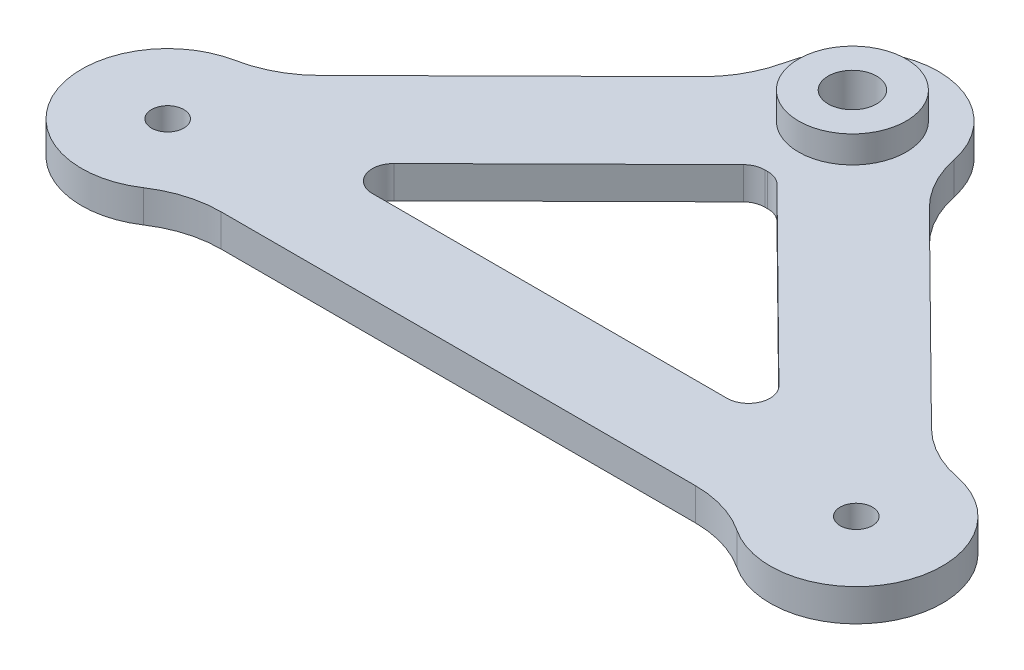
ISO-10303-21;
HEADER;
FILE_DESCRIPTION(('STEP AP214'),'2;1');
FILE_NAME('part.step','',(''),(''),'','','');
FILE_SCHEMA(('AUTOMOTIVE_DESIGN { 1 0 10303 214 1 1 1 1 }'));
ENDSEC;
DATA;
#1=APPLICATION_CONTEXT('core data for automotive mechanical design processes');
#2=APPLICATION_PROTOCOL_DEFINITION('international standard','automotive_design',2000,#1);
#3=PRODUCT_CONTEXT('',#1,'mechanical');
#4=PRODUCT('Part','Part','',(#3));
#5=PRODUCT_RELATED_PRODUCT_CATEGORY('part','',(#4));
#6=PRODUCT_DEFINITION_FORMATION('','',#4);
#7=PRODUCT_DEFINITION_CONTEXT('part definition',#1,'design');
#8=PRODUCT_DEFINITION('design','',#6,#7);
#9=PRODUCT_DEFINITION_SHAPE('','',#8);
#10=(LENGTH_UNIT() NAMED_UNIT(*) SI_UNIT(.MILLI.,.METRE.));
#11=(NAMED_UNIT(*) PLANE_ANGLE_UNIT() SI_UNIT($,.RADIAN.));
#12=(NAMED_UNIT(*) SI_UNIT($,.STERADIAN.) SOLID_ANGLE_UNIT());
#13=UNCERTAINTY_MEASURE_WITH_UNIT(LENGTH_MEASURE(1.E-05),#10,'distance_accuracy_value','');
#14=(GEOMETRIC_REPRESENTATION_CONTEXT(3) GLOBAL_UNCERTAINTY_ASSIGNED_CONTEXT((#13)) GLOBAL_UNIT_ASSIGNED_CONTEXT((#10,
#11,#12)) REPRESENTATION_CONTEXT('',''));
#15=CARTESIAN_POINT('',(0.,0.,0.));
#16=DIRECTION('',(0.,0.,1.));
#17=DIRECTION('',(1.,0.,0.));
#18=AXIS2_PLACEMENT_3D('',#15,#16,#17);
#19=CARTESIAN_POINT('',(0.,5.5,-29.5470634829801));
#20=DIRECTION('',(0.,1.,0.));
#21=DIRECTION('',(0.,0.,1.));
#22=AXIS2_PLACEMENT_3D('',#19,#20,#21);
#23=PLANE('',#22);
#24=CARTESIAN_POINT('',(0.,5.5,-29.5470634829801));
#25=DIRECTION('',(0.,1.,0.));
#26=DIRECTION('',(0.,0.,1.));
#27=AXIS2_PLACEMENT_3D('',#24,#25,#26);
#28=CIRCLE('',#27,5.);
#29=CARTESIAN_POINT('',(0.,5.5,-24.5470634829801));
#30=VERTEX_POINT('',#29);
#31=EDGE_CURVE('E11',#30,#30,#28,.T.);
#32=ORIENTED_EDGE('',*,*,#31,.T.);
#33=EDGE_LOOP('',(#32));
#34=FACE_BOUND('',#33,.T.);
#35=CARTESIAN_POINT('',(0.,5.5,-29.5470634829801));
#36=DIRECTION('',(0.,1.,0.));
#37=DIRECTION('',(0.,0.,1.));
#38=AXIS2_PLACEMENT_3D('',#35,#36,#37);
#39=CIRCLE('',#38,2.25);
#40=CARTESIAN_POINT('',(0.,5.5,-27.2970634829802));
#41=VERTEX_POINT('',#40);
#42=EDGE_CURVE('E52',#41,#41,#39,.T.);
#43=ORIENTED_EDGE('',*,*,#42,.F.);
#44=EDGE_LOOP('',(#43));
#45=FACE_BOUND('',#44,.T.);
#46=ADVANCED_FACE('F45',(#34,#45),#23,.T.);
#47=CARTESIAN_POINT('',(0.,5.5,-29.5470634829801));
#48=DIRECTION('',(0.,-1.,0.));
#49=DIRECTION('',(0.,0.,-1.));
#50=AXIS2_PLACEMENT_3D('',#47,#48,#49);
#51=CYLINDRICAL_SURFACE('',#50,5.);
#52=ORIENTED_EDGE('',*,*,#31,.F.);
#53=EDGE_LOOP('',(#52));
#54=FACE_BOUND('',#53,.T.);
#55=CARTESIAN_POINT('',(0.,0.,-29.5470634829801));
#56=DIRECTION('',(0.,1.,0.));
#57=DIRECTION('',(0.,0.,1.));
#58=AXIS2_PLACEMENT_3D('',#55,#56,#57);
#59=CIRCLE('',#58,5.);
#60=CARTESIAN_POINT('',(0.,0.,-24.5470634829801));
#61=VERTEX_POINT('',#60);
#62=EDGE_CURVE('E56',#61,#61,#59,.T.);
#63=ORIENTED_EDGE('',*,*,#62,.T.);
#64=EDGE_LOOP('',(#63));
#65=FACE_BOUND('',#64,.T.);
#66=ADVANCED_FACE('F47',(#54,#65),#51,.T.);
#67=CARTESIAN_POINT('',(0.,5.5,-29.5470634829801));
#68=DIRECTION('',(0.,-1.,0.));
#69=DIRECTION('',(0.,0.,-1.));
#70=AXIS2_PLACEMENT_3D('',#67,#68,#69);
#71=CYLINDRICAL_SURFACE('',#70,2.25);
#72=ORIENTED_EDGE('',*,*,#42,.T.);
#73=EDGE_LOOP('',(#72));
#74=FACE_BOUND('',#73,.T.);
#75=CARTESIAN_POINT('',(0.,0.,-29.5470634829801));
#76=DIRECTION('',(0.,1.,0.));
#77=DIRECTION('',(0.,0.,1.));
#78=AXIS2_PLACEMENT_3D('',#75,#76,#77);
#79=CIRCLE('',#78,2.25);
#80=CARTESIAN_POINT('',(0.,0.,-27.2970634829802));
#81=VERTEX_POINT('',#80);
#82=EDGE_CURVE('E60',#81,#81,#79,.T.);
#83=ORIENTED_EDGE('',*,*,#82,.F.);
#84=EDGE_LOOP('',(#83));
#85=FACE_BOUND('',#84,.T.);
#86=ADVANCED_FACE('F69',(#74,#85),#71,.F.);
#87=CARTESIAN_POINT('',(0.,0.,-29.5470634829801));
#88=DIRECTION('',(0.,1.,0.));
#89=DIRECTION('',(0.,0.,1.));
#90=AXIS2_PLACEMENT_3D('',#87,#88,#89);
#91=PLANE('',#90);
#92=ORIENTED_EDGE('',*,*,#82,.T.);
#93=EDGE_LOOP('',(#92));
#94=FACE_BOUND('',#93,.T.);
#95=ORIENTED_EDGE('',*,*,#62,.F.);
#96=EDGE_LOOP('',(#95));
#97=FACE_BOUND('',#96,.T.);
#98=ADVANCED_FACE('F66',(#94,#97),#91,.F.);
#99=CLOSED_SHELL('',(#46,#66,#86,#98));
#100=MANIFOLD_SOLID_BREP('B2',#99);
#101=CARTESIAN_POINT('',(0.,3.,0.));
#102=DIRECTION('',(1.,0.,0.));
#103=DIRECTION('',(0.,0.,-1.));
#104=AXIS2_PLACEMENT_3D('',#101,#102,#103);
#105=PLANE('',#104);
#106=DIRECTION('',(0.,0.,1.));
#107=VECTOR('',#106,1.);
#108=CARTESIAN_POINT('',(0.,0.,0.));
#109=LINE('',#108,#107);
#110=CARTESIAN_POINT('',(0.,0.,-22.5169864866705));
#111=VERTEX_POINT('',#110);
#112=CARTESIAN_POINT('',(0.,0.,-22.5158134829802));
#113=VERTEX_POINT('',#112);
#114=EDGE_CURVE('E268',#111,#113,#109,.T.);
#115=ORIENTED_EDGE('',*,*,#114,.F.);
#116=DIRECTION('',(0.,-1.,0.));
#117=VECTOR('',#116,1.);
#118=CARTESIAN_POINT('',(0.,3.,-22.5169864866705));
#119=LINE('',#118,#117);
#120=CARTESIAN_POINT('',(0.,3.,-22.5169864866705));
#121=VERTEX_POINT('',#120);
#122=EDGE_CURVE('E262',#121,#111,#119,.T.);
#123=ORIENTED_EDGE('',*,*,#122,.F.);
#124=DIRECTION('',(0.,0.,1.));
#125=VECTOR('',#124,1.);
#126=CARTESIAN_POINT('',(0.,3.,0.));
#127=LINE('',#126,#125);
#128=CARTESIAN_POINT('',(0.,3.,-22.5158134829802));
#129=VERTEX_POINT('',#128);
#130=EDGE_CURVE('E265',#121,#129,#127,.T.);
#131=ORIENTED_EDGE('',*,*,#130,.T.);
#132=DIRECTION('',(0.,-1.,0.));
#133=VECTOR('',#132,1.);
#134=CARTESIAN_POINT('',(0.,3.,-22.5158134829802));
#135=LINE('',#134,#133);
#136=EDGE_CURVE('E300',#129,#113,#135,.T.);
#137=ORIENTED_EDGE('',*,*,#136,.T.);
#138=EDGE_LOOP('',(#115,#123,#131,#137));
#139=FACE_BOUND('',#138,.T.);
#140=ADVANCED_FACE('F107',(#139),#105,.T.);
#141=CARTESIAN_POINT('',(11.2577723363418,3.,-11.3858986330326));
#142=DIRECTION('',(0.703094453053331,0.,-0.711096470308802));
#143=DIRECTION('',(-0.711096470308802,0.,-0.703094453053331));
#144=AXIS2_PLACEMENT_3D('',#141,#142,#143);
#145=PLANE('',#144);
#146=DIRECTION('',(0.711096470308802,0.,0.703094453053331));
#147=VECTOR('',#146,1.);
#148=CARTESIAN_POINT('',(11.2577723363418,0.,-11.3858986330326));
#149=LINE('',#148,#147);
#150=CARTESIAN_POINT('',(0.000593189258373851,0.,-22.5163999726115));
#151=VERTEX_POINT('',#150);
#152=EDGE_CURVE('E331',#111,#151,#149,.T.);
#153=ORIENTED_EDGE('',*,*,#152,.T.);
#154=DIRECTION('',(0.,-1.,0.));
#155=VECTOR('',#154,1.);
#156=CARTESIAN_POINT('',(0.000593189258373851,3.,-22.5163999726115));
#157=LINE('',#156,#155);
#158=CARTESIAN_POINT('',(0.000593189258373851,3.,-22.5163999726115));
#159=VERTEX_POINT('',#158);
#160=EDGE_CURVE('E273',#159,#151,#157,.T.);
#161=ORIENTED_EDGE('',*,*,#160,.F.);
#162=DIRECTION('',(0.711096470308802,0.,0.703094453053331));
#163=VECTOR('',#162,1.);
#164=CARTESIAN_POINT('',(11.2577723363418,3.,-11.3858986330326));
#165=LINE('',#164,#163);
#166=EDGE_CURVE('E276',#121,#159,#165,.T.);
#167=ORIENTED_EDGE('',*,*,#166,.F.);
#168=ORIENTED_EDGE('',*,*,#122,.T.);
#169=EDGE_LOOP('',(#153,#161,#167,#168));
#170=FACE_BOUND('',#169,.T.);
#171=ADVANCED_FACE('F277',(#170),#145,.F.);
#172=CARTESIAN_POINT('',(11.2577723363418,3.,-11.3858986330326));
#173=DIRECTION('',(0.703094453053331,0.,-0.711096470308802));
#174=DIRECTION('',(-0.711096470308802,0.,-0.703094453053331));
#175=AXIS2_PLACEMENT_3D('',#172,#173,#174);
#176=PLANE('',#175);
#177=DIRECTION('',(0.711096470308802,0.,0.703094453053331));
#178=VECTOR('',#177,1.);
#179=CARTESIAN_POINT('',(11.2577723363418,0.,-11.3858986330326));
#180=LINE('',#179,#178);
#181=CARTESIAN_POINT('',(1.56408418580728,0.,-20.9705030472689));
#182=VERTEX_POINT('',#181);
#183=CARTESIAN_POINT('',(17.8876045404997,0.,-4.83067238448501));
#184=VERTEX_POINT('',#183);
#185=EDGE_CURVE('E319',#182,#184,#180,.T.);
#186=ORIENTED_EDGE('',*,*,#185,.T.);
#187=DIRECTION('',(0.,-1.,0.));
#188=VECTOR('',#187,1.);
#189=CARTESIAN_POINT('',(17.8876045404997,3.,-4.83067238448501));
#190=LINE('',#189,#188);
#191=CARTESIAN_POINT('',(17.8876045404997,3.,-4.83067238448501));
#192=VERTEX_POINT('',#191);
#193=EDGE_CURVE('E409',#184,#192,#190,.F.);
#194=ORIENTED_EDGE('',*,*,#193,.T.);
#195=DIRECTION('',(0.711096470308802,0.,0.703094453053331));
#196=VECTOR('',#195,1.);
#197=CARTESIAN_POINT('',(11.2577723363418,3.,-11.3858986330326));
#198=LINE('',#197,#196);
#199=CARTESIAN_POINT('',(1.56408418580728,3.,-20.9705030472689));
#200=VERTEX_POINT('',#199);
#201=EDGE_CURVE('E454',#200,#192,#198,.T.);
#202=ORIENTED_EDGE('',*,*,#201,.F.);
#203=DIRECTION('',(0.,1.,0.));
#204=VECTOR('',#203,1.);
#205=CARTESIAN_POINT('',(1.56408418580728,0.,-20.9705030472689));
#206=LINE('',#205,#204);
#207=EDGE_CURVE('E406',#200,#182,#206,.F.);
#208=ORIENTED_EDGE('',*,*,#207,.T.);
#209=EDGE_LOOP('',(#186,#194,#202,#208));
#210=FACE_BOUND('',#209,.T.);
#211=ADVANCED_FACE('F452',(#210),#176,.F.);
#212=CARTESIAN_POINT('',(0.,3.,-1.4084794438674));
#213=DIRECTION('',(0.,0.,-1.));
#214=DIRECTION('',(-1.,0.,0.));
#215=AXIS2_PLACEMENT_3D('',#212,#213,#214);
#216=PLANE('',#215);
#217=DIRECTION('',(1.,0.,0.));
#218=VECTOR('',#217,1.);
#219=CARTESIAN_POINT('',(0.,3.,-1.4084794438674));
#220=LINE('',#219,#218);
#221=CARTESIAN_POINT('',(-16.4809742625331,3.,-1.4084794438674));
#222=VERTEX_POINT('',#221);
#223=CARTESIAN_POINT('',(16.481415634393,3.,-1.4084794438674));
#224=VERTEX_POINT('',#223);
#225=EDGE_CURVE('E465',#222,#224,#220,.T.);
#226=ORIENTED_EDGE('',*,*,#225,.T.);
#227=DIRECTION('',(0.,-1.,0.));
#228=VECTOR('',#227,1.);
#229=CARTESIAN_POINT('',(16.481415634393,3.,-1.4084794438674));
#230=LINE('',#229,#228);
#231=CARTESIAN_POINT('',(16.481415634393,0.,-1.4084794438674));
#232=VERTEX_POINT('',#231);
#233=EDGE_CURVE('E403',#224,#232,#230,.T.);
#234=ORIENTED_EDGE('',*,*,#233,.T.);
#235=DIRECTION('',(1.,0.,0.));
#236=VECTOR('',#235,1.);
#237=CARTESIAN_POINT('',(0.,0.,-1.4084794438674));
#238=LINE('',#237,#236);
#239=CARTESIAN_POINT('',(-16.4809742625331,0.,-1.4084794438674));
#240=VERTEX_POINT('',#239);
#241=EDGE_CURVE('E322',#240,#232,#238,.T.);
#242=ORIENTED_EDGE('',*,*,#241,.F.);
#243=DIRECTION('',(0.,-1.,0.));
#244=VECTOR('',#243,1.);
#245=CARTESIAN_POINT('',(-16.4809742625331,3.,-1.4084794438674));
#246=LINE('',#245,#244);
#247=EDGE_CURVE('E401',#240,#222,#246,.F.);
#248=ORIENTED_EDGE('',*,*,#247,.T.);
#249=EDGE_LOOP('',(#226,#234,#242,#248));
#250=FACE_BOUND('',#249,.T.);
#251=ADVANCED_FACE('F462',(#250),#216,.T.);
#252=CARTESIAN_POINT('',(-11.257180556488,3.,-11.3857743242329));
#253=DIRECTION('',(-0.703079645313617,0.,-0.711111111111111));
#254=DIRECTION('',(-0.711111111111111,0.,0.703079645313617));
#255=AXIS2_PLACEMENT_3D('',#252,#253,#254);
#256=PLANE('',#255);
#257=DIRECTION('',(0.711111111111111,0.,-0.703079645313617));
#258=VECTOR('',#257,1.);
#259=CARTESIAN_POINT('',(-11.257180556488,3.,-11.3857743242329));
#260=LINE('',#259,#258);
#261=CARTESIAN_POINT('',(-17.8871335531603,3.,-4.83070166608962));
#262=VERTEX_POINT('',#261);
#263=CARTESIAN_POINT('',(-1.56295087817351,3.,-20.9705149608521));
#264=VERTEX_POINT('',#263);
#265=EDGE_CURVE('E286',#262,#264,#260,.T.);
#266=ORIENTED_EDGE('',*,*,#265,.F.);
#267=DIRECTION('',(0.,-1.,0.));
#268=VECTOR('',#267,1.);
#269=CARTESIAN_POINT('',(-17.8871335531603,3.,-4.83070166608962));
#270=LINE('',#269,#268);
#271=CARTESIAN_POINT('',(-17.8871335531603,0.,-4.83070166608962));
#272=VERTEX_POINT('',#271);
#273=EDGE_CURVE('E413',#262,#272,#270,.T.);
#274=ORIENTED_EDGE('',*,*,#273,.T.);
#275=DIRECTION('',(0.711111111111111,0.,-0.703079645313617));
#276=VECTOR('',#275,1.);
#277=CARTESIAN_POINT('',(-11.257180556488,0.,-11.3857743242329));
#278=LINE('',#277,#276);
#279=CARTESIAN_POINT('',(-1.56295087817351,0.,-20.9705149608521));
#280=VERTEX_POINT('',#279);
#281=EDGE_CURVE('E325',#272,#280,#278,.T.);
#282=ORIENTED_EDGE('',*,*,#281,.T.);
#283=DIRECTION('',(0.,1.,0.));
#284=VECTOR('',#283,1.);
#285=CARTESIAN_POINT('',(-1.56295087817351,3.,-20.9705149608521));
#286=LINE('',#285,#284);
#287=EDGE_CURVE('E411',#280,#264,#286,.T.);
#288=ORIENTED_EDGE('',*,*,#287,.T.);
#289=EDGE_LOOP('',(#266,#274,#282,#288));
#290=FACE_BOUND('',#289,.T.);
#291=ADVANCED_FACE('F442',(#290),#256,.F.);
#292=CARTESIAN_POINT('',(0.,3.,7.09152055613258));
#293=DIRECTION('',(0.,0.,-1.));
#294=DIRECTION('',(-1.,0.,0.));
#295=AXIS2_PLACEMENT_3D('',#292,#293,#294);
#296=PLANE('',#295);
#297=DIRECTION('',(1.,0.,0.));
#298=VECTOR('',#297,1.);
#299=CARTESIAN_POINT('',(0.,0.,7.09152055613258));
#300=LINE('',#299,#298);
#301=CARTESIAN_POINT('',(-22.0501256289338,0.,7.09152055613258));
#302=VERTEX_POINT('',#301);
#303=CARTESIAN_POINT('',(22.0501256289338,0.,7.09152055613259));
#304=VERTEX_POINT('',#303);
#305=EDGE_CURVE('E301',#302,#304,#300,.T.);
#306=ORIENTED_EDGE('',*,*,#305,.T.);
#307=DIRECTION('',(0.,1.,0.));
#308=VECTOR('',#307,1.);
#309=CARTESIAN_POINT('',(22.0501256289338,3.,7.09152055613259));
#310=LINE('',#309,#308);
#311=CARTESIAN_POINT('',(22.0501256289338,3.,7.09152055613259));
#312=VERTEX_POINT('',#311);
#313=EDGE_CURVE('E365',#304,#312,#310,.T.);
#314=ORIENTED_EDGE('',*,*,#313,.T.);
#315=DIRECTION('',(1.,0.,0.));
#316=VECTOR('',#315,1.);
#317=CARTESIAN_POINT('',(0.,3.,7.09152055613258));
#318=LINE('',#317,#316);
#319=CARTESIAN_POINT('',(-22.0501256289338,3.,7.09152055613258));
#320=VERTEX_POINT('',#319);
#321=EDGE_CURVE('E345',#320,#312,#318,.T.);
#322=ORIENTED_EDGE('',*,*,#321,.F.);
#323=DIRECTION('',(0.,1.,0.));
#324=VECTOR('',#323,1.);
#325=CARTESIAN_POINT('',(-22.0501256289338,0.,7.09152055613258));
#326=LINE('',#325,#324);
#327=EDGE_CURVE('E362',#320,#302,#326,.F.);
#328=ORIENTED_EDGE('',*,*,#327,.T.);
#329=EDGE_LOOP('',(#306,#314,#322,#328));
#330=FACE_BOUND('',#329,.T.);
#331=ADVANCED_FACE('F541',(#330),#296,.F.);
#332=CARTESIAN_POINT('',(32.,3.,2.09152055613259));
#333=DIRECTION('',(0.,-1.,0.));
#334=DIRECTION('',(0.,0.,-1.));
#335=AXIS2_PLACEMENT_3D('',#332,#333,#334);
#336=CYLINDRICAL_SURFACE('',#335,8.);
#337=CARTESIAN_POINT('',(32.,0.,2.09152055613259));
#338=DIRECTION('',(0.,1.,0.));
#339=DIRECTION('',(0.,0.,1.));
#340=AXIS2_PLACEMENT_3D('',#337,#338,#339);
#341=CIRCLE('',#340,8.);
#342=CARTESIAN_POINT('',(27.5778336128595,0.,8.75818722279926));
#343=VERTEX_POINT('',#342);
#344=CARTESIAN_POINT('',(33.5419702056243,0.,-5.7584684811188));
#345=VERTEX_POINT('',#344);
#346=EDGE_CURVE('E304',#343,#345,#341,.T.);
#347=ORIENTED_EDGE('',*,*,#346,.T.);
#348=DIRECTION('',(0.,-1.,0.));
#349=VECTOR('',#348,1.);
#350=CARTESIAN_POINT('',(33.5419702056243,3.,-5.7584684811188));
#351=LINE('',#350,#349);
#352=CARTESIAN_POINT('',(33.5419702056243,3.,-5.7584684811188));
#353=VERTEX_POINT('',#352);
#354=EDGE_CURVE('E360',#345,#353,#351,.F.);
#355=ORIENTED_EDGE('',*,*,#354,.T.);
#356=CARTESIAN_POINT('',(32.,3.,2.09152055613259));
#357=DIRECTION('',(0.,1.,0.));
#358=DIRECTION('',(0.,0.,1.));
#359=AXIS2_PLACEMENT_3D('',#356,#357,#358);
#360=CIRCLE('',#359,8.);
#361=CARTESIAN_POINT('',(27.5778336128595,3.,8.75818722279926));
#362=VERTEX_POINT('',#361);
#363=EDGE_CURVE('E482',#362,#353,#360,.T.);
#364=ORIENTED_EDGE('',*,*,#363,.F.);
#365=DIRECTION('',(0.,-1.,0.));
#366=VECTOR('',#365,1.);
#367=CARTESIAN_POINT('',(27.5778336128595,3.,8.75818722279926));
#368=LINE('',#367,#366);
#369=EDGE_CURVE('E357',#362,#343,#368,.T.);
#370=ORIENTED_EDGE('',*,*,#369,.T.);
#371=EDGE_LOOP('',(#347,#355,#364,#370));
#372=FACE_BOUND('',#371,.T.);
#373=ADVANCED_FACE('F499',(#372),#336,.T.);
#374=CARTESIAN_POINT('',(18.2880580238333,3.,-18.4961969946937));
#375=DIRECTION('',(-0.70309445305332,0.,0.711096470308813));
#376=DIRECTION('',(0.711096470308813,0.,0.70309445305332));
#377=AXIS2_PLACEMENT_3D('',#374,#375,#376);
#378=PLANE('',#377);
#379=DIRECTION('',(-0.711096470308813,0.,-0.70309445305332));
#380=VECTOR('',#379,1.);
#381=CARTESIAN_POINT('',(18.2880580238333,0.,-18.4961969946937));
#382=LINE('',#381,#380);
#383=CARTESIAN_POINT('',(28.4384884321214,0.,-8.45999007459491));
#384=VERTEX_POINT('',#383);
#385=CARTESIAN_POINT('',(10.5907928105479,0.,-26.1068443556502));
#386=VERTEX_POINT('',#385);
#387=EDGE_CURVE('E307',#384,#386,#382,.T.);
#388=ORIENTED_EDGE('',*,*,#387,.T.);
#389=DIRECTION('',(0.,1.,0.));
#390=VECTOR('',#389,1.);
#391=CARTESIAN_POINT('',(10.5907928105479,3.,-26.1068443556502));
#392=LINE('',#391,#390);
#393=CARTESIAN_POINT('',(10.5907928105479,3.,-26.1068443556502));
#394=VERTEX_POINT('',#393);
#395=EDGE_CURVE('E355',#386,#394,#392,.T.);
#396=ORIENTED_EDGE('',*,*,#395,.T.);
#397=DIRECTION('',(-0.711096470308813,0.,-0.70309445305332));
#398=VECTOR('',#397,1.);
#399=CARTESIAN_POINT('',(18.2880580238333,3.,-18.4961969946937));
#400=LINE('',#399,#398);
#401=CARTESIAN_POINT('',(28.4384884321214,3.,-8.45999007459491));
#402=VERTEX_POINT('',#401);
#403=EDGE_CURVE('E479',#402,#394,#400,.T.);
#404=ORIENTED_EDGE('',*,*,#403,.F.);
#405=DIRECTION('',(0.,1.,0.));
#406=VECTOR('',#405,1.);
#407=CARTESIAN_POINT('',(28.4384884321214,0.,-8.45999007459491));
#408=LINE('',#407,#406);
#409=EDGE_CURVE('E352',#402,#384,#408,.F.);
#410=ORIENTED_EDGE('',*,*,#409,.T.);
#411=EDGE_LOOP('',(#388,#396,#404,#410));
#412=FACE_BOUND('',#411,.T.);
#413=ADVANCED_FACE('F510',(#412),#378,.F.);
#414=CARTESIAN_POINT('',(0.,3.,-29.5470634829801));
#415=DIRECTION('',(0.,-1.,0.));
#416=DIRECTION('',(0.,0.,-1.));
#417=AXIS2_PLACEMENT_3D('',#414,#415,#416);
#418=CYLINDRICAL_SURFACE('',#417,8.);
#419=CARTESIAN_POINT('',(0.,3.,-29.5470634829801));
#420=DIRECTION('',(0.,1.,0.));
#421=DIRECTION('',(0.,0.,1.));
#422=AXIS2_PLACEMENT_3D('',#419,#420,#421);
#423=CIRCLE('',#422,8.);
#424=CARTESIAN_POINT('',(7.83188326270271,3.,-31.1785059610949));
#425=VERTEX_POINT('',#424);
#426=CARTESIAN_POINT('',(-7.83184928850183,3.,-31.1786690487323));
#427=VERTEX_POINT('',#426);
#428=EDGE_CURVE('E476',#425,#427,#423,.T.);
#429=ORIENTED_EDGE('',*,*,#428,.F.);
#430=DIRECTION('',(0.,-1.,0.));
#431=VECTOR('',#430,1.);
#432=CARTESIAN_POINT('',(7.83188326270271,3.,-31.1785059610949));
#433=LINE('',#432,#431);
#434=CARTESIAN_POINT('',(7.83188326270271,0.,-31.1785059610949));
#435=VERTEX_POINT('',#434);
#436=EDGE_CURVE('E349',#425,#435,#433,.T.);
#437=ORIENTED_EDGE('',*,*,#436,.T.);
#438=CARTESIAN_POINT('',(0.,0.,-29.5470634829801));
#439=DIRECTION('',(0.,1.,0.));
#440=DIRECTION('',(0.,0.,1.));
#441=AXIS2_PLACEMENT_3D('',#438,#439,#440);
#442=CIRCLE('',#441,8.);
#443=CARTESIAN_POINT('',(-7.83184928850183,0.,-31.1786690487323));
#444=VERTEX_POINT('',#443);
#445=EDGE_CURVE('E310',#435,#444,#442,.T.);
#446=ORIENTED_EDGE('',*,*,#445,.T.);
#447=DIRECTION('',(0.,-1.,0.));
#448=VECTOR('',#447,1.);
#449=CARTESIAN_POINT('',(-7.83184928850183,3.,-31.1786690487323));
#450=LINE('',#449,#448);
#451=EDGE_CURVE('E272',#444,#427,#450,.F.);
#452=ORIENTED_EDGE('',*,*,#451,.T.);
#453=EDGE_LOOP('',(#429,#437,#446,#452));
#454=FACE_BOUND('',#453,.T.);
#455=ADVANCED_FACE('F519',(#454),#418,.T.);
#456=CARTESIAN_POINT('',(-18.2879770096242,3.,-18.496885435344));
#457=DIRECTION('',(-0.703079645313617,0.,-0.711111111111111));
#458=DIRECTION('',(-0.711111111111111,0.,0.703079645313617));
#459=AXIS2_PLACEMENT_3D('',#456,#457,#458);
#460=PLANE('',#459);
#461=DIRECTION('',(0.711111111111111,0.,-0.703079645313617));
#462=VECTOR('',#461,1.);
#463=CARTESIAN_POINT('',(-18.2879770096242,0.,-18.496885435344));
#464=LINE('',#463,#462);
#465=CARTESIAN_POINT('',(-28.4399320071432,0.,-8.45958914314723));
#466=VERTEX_POINT('',#465);
#467=CARTESIAN_POINT('',(-10.5908644459929,0.,-26.1070648948114));
#468=VERTEX_POINT('',#467);
#469=EDGE_CURVE('E313',#466,#468,#464,.T.);
#470=ORIENTED_EDGE('',*,*,#469,.F.);
#471=DIRECTION('',(0.,-1.,0.));
#472=VECTOR('',#471,1.);
#473=CARTESIAN_POINT('',(-28.4399320071432,3.,-8.45958914314724));
#474=LINE('',#473,#472);
#475=CARTESIAN_POINT('',(-28.4399320071432,3.,-8.45958914314723));
#476=VERTEX_POINT('',#475);
#477=EDGE_CURVE('E375',#466,#476,#474,.F.);
#478=ORIENTED_EDGE('',*,*,#477,.T.);
#479=DIRECTION('',(0.711111111111111,0.,-0.703079645313617));
#480=VECTOR('',#479,1.);
#481=CARTESIAN_POINT('',(-18.2879770096242,3.,-18.496885435344));
#482=LINE('',#481,#480);
#483=CARTESIAN_POINT('',(-10.5908644459929,3.,-26.1070648948114));
#484=VERTEX_POINT('',#483);
#485=EDGE_CURVE('E473',#476,#484,#482,.T.);
#486=ORIENTED_EDGE('',*,*,#485,.T.);
#487=DIRECTION('',(0.,-1.,0.));
#488=VECTOR('',#487,1.);
#489=CARTESIAN_POINT('',(-10.5908644459929,3.,-26.1070648948114));
#490=LINE('',#489,#488);
#491=EDGE_CURVE('E372',#484,#468,#490,.T.);
#492=ORIENTED_EDGE('',*,*,#491,.T.);
#493=EDGE_LOOP('',(#470,#478,#486,#492));
#494=FACE_BOUND('',#493,.T.);
#495=ADVANCED_FACE('F527',(#494),#460,.T.);
#496=CARTESIAN_POINT('',(-32.,3.,2.0915205561326));
#497=DIRECTION('',(0.,-1.,0.));
#498=DIRECTION('',(0.,0.,-1.));
#499=AXIS2_PLACEMENT_3D('',#496,#497,#498);
#500=CYLINDRICAL_SURFACE('',#499,1.5);
#501=CARTESIAN_POINT('',(-32.,3.,2.0915205561326));
#502=DIRECTION('',(0.,1.,0.));
#503=DIRECTION('',(0.,0.,1.));
#504=AXIS2_PLACEMENT_3D('',#501,#502,#503);
#505=CIRCLE('',#504,1.5);
#506=CARTESIAN_POINT('',(-32.,3.,3.5915205561326));
#507=VERTEX_POINT('',#506);
#508=EDGE_CURVE('E294',#507,#507,#505,.T.);
#509=ORIENTED_EDGE('',*,*,#508,.T.);
#510=EDGE_LOOP('',(#509));
#511=FACE_BOUND('',#510,.T.);
#512=CARTESIAN_POINT('',(-32.,0.,2.0915205561326));
#513=DIRECTION('',(0.,1.,0.));
#514=DIRECTION('',(0.,0.,1.));
#515=AXIS2_PLACEMENT_3D('',#512,#513,#514);
#516=CIRCLE('',#515,1.5);
#517=CARTESIAN_POINT('',(-32.,0.,3.5915205561326));
#518=VERTEX_POINT('',#517);
#519=EDGE_CURVE('E339',#518,#518,#516,.T.);
#520=ORIENTED_EDGE('',*,*,#519,.F.);
#521=EDGE_LOOP('',(#520));
#522=FACE_BOUND('',#521,.T.);
#523=ADVANCED_FACE('F571',(#511,#522),#500,.F.);
#524=CARTESIAN_POINT('',(0.,3.,-29.5470634829801));
#525=DIRECTION('',(0.,-1.,0.));
#526=DIRECTION('',(0.,0.,-1.));
#527=AXIS2_PLACEMENT_3D('',#524,#525,#526);
#528=CYLINDRICAL_SURFACE('',#527,5.);
#529=CARTESIAN_POINT('',(0.,3.,-29.5470634829801));
#530=DIRECTION('',(0.,1.,0.));
#531=DIRECTION('',(0.,0.,1.));
#532=AXIS2_PLACEMENT_3D('',#529,#530,#531);
#533=CIRCLE('',#532,5.);
#534=CARTESIAN_POINT('',(0.,3.,-24.5470634829801));
#535=VERTEX_POINT('',#534);
#536=EDGE_CURVE('E291',#535,#535,#533,.T.);
#537=ORIENTED_EDGE('',*,*,#536,.T.);
#538=EDGE_LOOP('',(#537));
#539=FACE_BOUND('',#538,.T.);
#540=CARTESIAN_POINT('',(0.,0.,-29.5470634829801));
#541=DIRECTION('',(0.,1.,0.));
#542=DIRECTION('',(0.,0.,1.));
#543=AXIS2_PLACEMENT_3D('',#540,#541,#542);
#544=CIRCLE('',#543,5.);
#545=CARTESIAN_POINT('',(0.,0.,-24.5470634829801));
#546=VERTEX_POINT('',#545);
#547=EDGE_CURVE('E336',#546,#546,#544,.T.);
#548=ORIENTED_EDGE('',*,*,#547,.F.);
#549=EDGE_LOOP('',(#548));
#550=FACE_BOUND('',#549,.T.);
#551=ADVANCED_FACE('F594',(#539,#550),#528,.F.);
#552=CARTESIAN_POINT('',(-11.257180556488,3.,-11.3857743242329));
#553=DIRECTION('',(-0.703079645313617,0.,-0.711111111111111));
#554=DIRECTION('',(-0.711111111111111,0.,0.703079645313617));
#555=AXIS2_PLACEMENT_3D('',#552,#553,#554);
#556=PLANE('',#555);
#557=DIRECTION('',(0.711111111111111,0.,-0.703079645313617));
#558=VECTOR('',#557,1.);
#559=CARTESIAN_POINT('',(-11.257180556488,0.,-11.3857743242329));
#560=LINE('',#559,#558);
#561=EDGE_CURVE('E333',#113,#151,#560,.T.);
#562=ORIENTED_EDGE('',*,*,#561,.F.);
#563=ORIENTED_EDGE('',*,*,#136,.F.);
#564=DIRECTION('',(0.711111111111111,0.,-0.703079645313617));
#565=VECTOR('',#564,1.);
#566=CARTESIAN_POINT('',(-11.257180556488,3.,-11.3857743242329));
#567=LINE('',#566,#565);
#568=EDGE_CURVE('E280',#129,#159,#567,.T.);
#569=ORIENTED_EDGE('',*,*,#568,.T.);
#570=ORIENTED_EDGE('',*,*,#160,.T.);
#571=EDGE_LOOP('',(#562,#563,#569,#570));
#572=FACE_BOUND('',#571,.T.);
#573=ADVANCED_FACE('F560',(#572),#556,.T.);
#574=CARTESIAN_POINT('',(0.,3.,-29.5470634829801));
#575=DIRECTION('',(0.,-1.,0.));
#576=DIRECTION('',(0.,0.,-1.));
#577=AXIS2_PLACEMENT_3D('',#574,#575,#576);
#578=CYLINDRICAL_SURFACE('',#577,8.);
#579=CARTESIAN_POINT('',(0.,0.,-29.5470634829801));
#580=DIRECTION('',(0.,1.,0.));
#581=DIRECTION('',(0.,0.,1.));
#582=AXIS2_PLACEMENT_3D('',#579,#580,#581);
#583=CIRCLE('',#582,8.);
#584=CARTESIAN_POINT('',(-0.125433270037022,0.,-21.5480468874999));
#585=VERTEX_POINT('',#584);
#586=CARTESIAN_POINT('',(0.126316223760494,0.,-21.548060781917));
#587=VERTEX_POINT('',#586);
#588=EDGE_CURVE('E328',#585,#587,#583,.T.);
#589=ORIENTED_EDGE('',*,*,#588,.T.);
#590=DIRECTION('',(0.,-1.,0.));
#591=VECTOR('',#590,1.);
#592=CARTESIAN_POINT('',(0.126316223760494,3.,-21.548060781917));
#593=LINE('',#592,#591);
#594=CARTESIAN_POINT('',(0.126316223760494,3.,-21.548060781917));
#595=VERTEX_POINT('',#594);
#596=EDGE_CURVE('E122',#587,#595,#593,.F.);
#597=ORIENTED_EDGE('',*,*,#596,.T.);
#598=CARTESIAN_POINT('',(0.,3.,-29.5470634829801));
#599=DIRECTION('',(0.,1.,0.));
#600=DIRECTION('',(0.,0.,1.));
#601=AXIS2_PLACEMENT_3D('',#598,#599,#600);
#602=CIRCLE('',#601,8.);
#603=CARTESIAN_POINT('',(-0.125433270037022,3.,-21.5480468874999));
#604=VERTEX_POINT('',#603);
#605=EDGE_CURVE('E284',#604,#595,#602,.T.);
#606=ORIENTED_EDGE('',*,*,#605,.F.);
#607=DIRECTION('',(0.,-1.,0.));
#608=VECTOR('',#607,1.);
#609=CARTESIAN_POINT('',(-0.125433270037022,3.,-21.5480468874999));
#610=LINE('',#609,#608);
#611=EDGE_CURVE('E416',#604,#585,#610,.T.);
#612=ORIENTED_EDGE('',*,*,#611,.T.);
#613=EDGE_LOOP('',(#589,#597,#606,#612));
#614=FACE_BOUND('',#613,.T.);
#615=ADVANCED_FACE('F444',(#614),#578,.T.);
#616=CARTESIAN_POINT('',(-32.,3.,2.0915205561326));
#617=DIRECTION('',(0.,-1.,0.));
#618=DIRECTION('',(0.,0.,-1.));
#619=AXIS2_PLACEMENT_3D('',#616,#617,#618);
#620=CYLINDRICAL_SURFACE('',#619,8.);
#621=CARTESIAN_POINT('',(-32.,0.,2.0915205561326));
#622=DIRECTION('',(0.,1.,0.));
#623=DIRECTION('',(0.,0.,1.));
#624=AXIS2_PLACEMENT_3D('',#621,#622,#623);
#625=CIRCLE('',#624,8.);
#626=CARTESIAN_POINT('',(-33.5425459823464,0.,-5.75835535959671));
#627=VERTEX_POINT('',#626);
#628=CARTESIAN_POINT('',(-27.5778336128595,0.,8.75818722279926));
#629=VERTEX_POINT('',#628);
#630=EDGE_CURVE('E316',#627,#629,#625,.T.);
#631=ORIENTED_EDGE('',*,*,#630,.T.);
#632=DIRECTION('',(0.,-1.,0.));
#633=VECTOR('',#632,1.);
#634=CARTESIAN_POINT('',(-27.5778336128595,3.,8.75818722279926));
#635=LINE('',#634,#633);
#636=CARTESIAN_POINT('',(-27.5778336128595,3.,8.75818722279926));
#637=VERTEX_POINT('',#636);
#638=EDGE_CURVE('E370',#629,#637,#635,.F.);
#639=ORIENTED_EDGE('',*,*,#638,.T.);
#640=CARTESIAN_POINT('',(-32.,3.,2.0915205561326));
#641=DIRECTION('',(0.,1.,0.));
#642=DIRECTION('',(0.,0.,1.));
#643=AXIS2_PLACEMENT_3D('',#640,#641,#642);
#644=CIRCLE('',#643,8.);
#645=CARTESIAN_POINT('',(-33.5425459823464,3.,-5.75835535959671));
#646=VERTEX_POINT('',#645);
#647=EDGE_CURVE('E468',#646,#637,#644,.T.);
#648=ORIENTED_EDGE('',*,*,#647,.F.);
#649=DIRECTION('',(0.,-1.,0.));
#650=VECTOR('',#649,1.);
#651=CARTESIAN_POINT('',(-33.5425459823464,3.,-5.75835535959671));
#652=LINE('',#651,#650);
#653=EDGE_CURVE('E367',#646,#627,#652,.T.);
#654=ORIENTED_EDGE('',*,*,#653,.T.);
#655=EDGE_LOOP('',(#631,#639,#648,#654));
#656=FACE_BOUND('',#655,.T.);
#657=ADVANCED_FACE('F537',(#656),#620,.T.);
#658=CARTESIAN_POINT('',(32.,3.,2.09152055613259));
#659=DIRECTION('',(0.,-1.,0.));
#660=DIRECTION('',(0.,0.,-1.));
#661=AXIS2_PLACEMENT_3D('',#658,#659,#660);
#662=CYLINDRICAL_SURFACE('',#661,1.5);
#663=CARTESIAN_POINT('',(32.,3.,2.09152055613259));
#664=DIRECTION('',(0.,1.,0.));
#665=DIRECTION('',(0.,0.,1.));
#666=AXIS2_PLACEMENT_3D('',#663,#664,#665);
#667=CIRCLE('',#666,1.5);
#668=CARTESIAN_POINT('',(32.,3.,3.59152055613259));
#669=VERTEX_POINT('',#668);
#670=EDGE_CURVE('E297',#669,#669,#667,.T.);
#671=ORIENTED_EDGE('',*,*,#670,.T.);
#672=EDGE_LOOP('',(#671));
#673=FACE_BOUND('',#672,.T.);
#674=CARTESIAN_POINT('',(32.,0.,2.09152055613259));
#675=DIRECTION('',(0.,1.,0.));
#676=DIRECTION('',(0.,0.,1.));
#677=AXIS2_PLACEMENT_3D('',#674,#675,#676);
#678=CIRCLE('',#677,1.5);
#679=CARTESIAN_POINT('',(32.,0.,3.59152055613259));
#680=VERTEX_POINT('',#679);
#681=EDGE_CURVE('E342',#680,#680,#678,.T.);
#682=ORIENTED_EDGE('',*,*,#681,.F.);
#683=EDGE_LOOP('',(#682));
#684=FACE_BOUND('',#683,.T.);
#685=ADVANCED_FACE('F568',(#673,#684),#662,.F.);
#686=CARTESIAN_POINT('',(0.,3.,0.));
#687=DIRECTION('',(0.,1.,0.));
#688=DIRECTION('',(0.,0.,1.));
#689=AXIS2_PLACEMENT_3D('',#686,#687,#688);
#690=PLANE('',#689);
#691=ORIENTED_EDGE('',*,*,#647,.T.);
#692=CARTESIAN_POINT('',(-22.0501256289338,3.,17.0915205561326));
#693=DIRECTION('',(0.,1.,0.));
#694=DIRECTION('',(0.,0.,1.));
#695=AXIS2_PLACEMENT_3D('',#692,#693,#694);
#696=CIRCLE('',#695,10.);
#697=EDGE_CURVE('E391',#637,#320,#696,.F.);
#698=ORIENTED_EDGE('',*,*,#697,.T.);
#699=ORIENTED_EDGE('',*,*,#321,.T.);
#700=CARTESIAN_POINT('',(22.0501256289338,3.,17.0915205561326));
#701=DIRECTION('',(0.,1.,0.));
#702=DIRECTION('',(0.,0.,1.));
#703=AXIS2_PLACEMENT_3D('',#700,#701,#702);
#704=CIRCLE('',#703,10.);
#705=EDGE_CURVE('E387',#312,#362,#704,.F.);
#706=ORIENTED_EDGE('',*,*,#705,.T.);
#707=ORIENTED_EDGE('',*,*,#363,.T.);
#708=CARTESIAN_POINT('',(35.4694329626546,3.,-15.570954777683));
#709=DIRECTION('',(0.,1.,0.));
#710=DIRECTION('',(0.,0.,1.));
#711=AXIS2_PLACEMENT_3D('',#708,#709,#710);
#712=CIRCLE('',#711,10.);
#713=EDGE_CURVE('E383',#353,#402,#712,.F.);
#714=ORIENTED_EDGE('',*,*,#713,.T.);
#715=ORIENTED_EDGE('',*,*,#403,.T.);
#716=CARTESIAN_POINT('',(17.6217373410811,3.,-33.2178090587383));
#717=DIRECTION('',(0.,1.,0.));
#718=DIRECTION('',(0.,0.,1.));
#719=AXIS2_PLACEMENT_3D('',#716,#717,#718);
#720=CIRCLE('',#719,10.);
#721=EDGE_CURVE('E379',#394,#425,#720,.F.);
#722=ORIENTED_EDGE('',*,*,#721,.T.);
#723=ORIENTED_EDGE('',*,*,#428,.T.);
#724=CARTESIAN_POINT('',(-17.6216608991291,3.,-33.2181760059225));
#725=DIRECTION('',(0.,1.,0.));
#726=DIRECTION('',(0.,0.,1.));
#727=AXIS2_PLACEMENT_3D('',#724,#725,#726);
#728=CIRCLE('',#727,10.);
#729=EDGE_CURVE('E399',#427,#484,#728,.F.);
#730=ORIENTED_EDGE('',*,*,#729,.T.);
#731=ORIENTED_EDGE('',*,*,#485,.F.);
#732=CARTESIAN_POINT('',(-35.4707284602794,3.,-15.5707002542583));
#733=DIRECTION('',(0.,1.,0.));
#734=DIRECTION('',(0.,0.,1.));
#735=AXIS2_PLACEMENT_3D('',#732,#733,#734);
#736=CIRCLE('',#735,10.);
#737=EDGE_CURVE('E395',#476,#646,#736,.F.);
#738=ORIENTED_EDGE('',*,*,#737,.T.);
#739=EDGE_LOOP('',(#691,#698,#699,#706,#707,#714,#715,#722,#723,#730,#731,#738));
#740=FACE_BOUND('',#739,.T.);
#741=ORIENTED_EDGE('',*,*,#605,.T.);
#742=CARTESIAN_POINT('',(0.157895279700618,3.,-19.5483101066513));
#743=DIRECTION('',(0.,1.,0.));
#744=DIRECTION('',(0.,0.,1.));
#745=AXIS2_PLACEMENT_3D('',#742,#743,#744);
#746=CIRCLE('',#745,2.);
#747=EDGE_CURVE('E430',#595,#200,#746,.F.);
#748=ORIENTED_EDGE('',*,*,#747,.T.);
#749=ORIENTED_EDGE('',*,*,#201,.T.);
#750=CARTESIAN_POINT('',(16.481415634393,3.,-3.4084794438674));
#751=DIRECTION('',(0.,1.,0.));
#752=DIRECTION('',(0.,0.,1.));
#753=AXIS2_PLACEMENT_3D('',#750,#751,#752);
#754=CIRCLE('',#753,2.);
#755=EDGE_CURVE('E422',#192,#224,#754,.F.);
#756=ORIENTED_EDGE('',*,*,#755,.T.);
#757=ORIENTED_EDGE('',*,*,#225,.F.);
#758=CARTESIAN_POINT('',(-16.4809742625331,3.,-3.4084794438674));
#759=DIRECTION('',(0.,1.,0.));
#760=DIRECTION('',(0.,0.,1.));
#761=AXIS2_PLACEMENT_3D('',#758,#759,#760);
#762=CIRCLE('',#761,2.);
#763=EDGE_CURVE('E426',#222,#262,#762,.F.);
#764=ORIENTED_EDGE('',*,*,#763,.T.);
#765=ORIENTED_EDGE('',*,*,#265,.T.);
#766=CARTESIAN_POINT('',(-0.156791587546276,3.,-19.5482927386299));
#767=DIRECTION('',(0.,1.,0.));
#768=DIRECTION('',(0.,0.,1.));
#769=AXIS2_PLACEMENT_3D('',#766,#767,#768);
#770=CIRCLE('',#769,2.);
#771=EDGE_CURVE('E43',#264,#604,#770,.F.);
#772=ORIENTED_EDGE('',*,*,#771,.T.);
#773=EDGE_LOOP('',(#741,#748,#749,#756,#757,#764,#765,#772));
#774=FACE_BOUND('',#773,.T.);
#775=ORIENTED_EDGE('',*,*,#130,.F.);
#776=ORIENTED_EDGE('',*,*,#166,.T.);
#777=ORIENTED_EDGE('',*,*,#568,.F.);
#778=EDGE_LOOP('',(#775,#776,#777));
#779=FACE_BOUND('',#778,.T.);
#780=ORIENTED_EDGE('',*,*,#536,.F.);
#781=EDGE_LOOP('',(#780));
#782=FACE_BOUND('',#781,.T.);
#783=ORIENTED_EDGE('',*,*,#508,.F.);
#784=EDGE_LOOP('',(#783));
#785=FACE_BOUND('',#784,.T.);
#786=ORIENTED_EDGE('',*,*,#670,.F.);
#787=EDGE_LOOP('',(#786));
#788=FACE_BOUND('',#787,.T.);
#789=ADVANCED_FACE('F282',(#740,#774,#779,#782,#785,#788),#690,.T.);
#790=CARTESIAN_POINT('',(0.,0.,0.));
#791=DIRECTION('',(0.,1.,0.));
#792=DIRECTION('',(0.,0.,1.));
#793=AXIS2_PLACEMENT_3D('',#790,#791,#792);
#794=PLANE('',#793);
#795=ORIENTED_EDGE('',*,*,#305,.F.);
#796=CARTESIAN_POINT('',(-22.0501256289338,0.,17.0915205561326));
#797=DIRECTION('',(0.,1.,0.));
#798=DIRECTION('',(0.,0.,1.));
#799=AXIS2_PLACEMENT_3D('',#796,#797,#798);
#800=CIRCLE('',#799,10.);
#801=EDGE_CURVE('E389',#302,#629,#800,.T.);
#802=ORIENTED_EDGE('',*,*,#801,.T.);
#803=ORIENTED_EDGE('',*,*,#630,.F.);
#804=CARTESIAN_POINT('',(-35.4707284602794,0.,-15.5707002542583));
#805=DIRECTION('',(0.,1.,0.));
#806=DIRECTION('',(0.,0.,1.));
#807=AXIS2_PLACEMENT_3D('',#804,#805,#806);
#808=CIRCLE('',#807,10.);
#809=EDGE_CURVE('E393',#627,#466,#808,.T.);
#810=ORIENTED_EDGE('',*,*,#809,.T.);
#811=ORIENTED_EDGE('',*,*,#469,.T.);
#812=CARTESIAN_POINT('',(-17.6216608991291,0.,-33.2181760059225));
#813=DIRECTION('',(0.,1.,0.));
#814=DIRECTION('',(0.,0.,1.));
#815=AXIS2_PLACEMENT_3D('',#812,#813,#814);
#816=CIRCLE('',#815,10.);
#817=EDGE_CURVE('E397',#468,#444,#816,.T.);
#818=ORIENTED_EDGE('',*,*,#817,.T.);
#819=ORIENTED_EDGE('',*,*,#445,.F.);
#820=CARTESIAN_POINT('',(17.6217373410811,0.,-33.2178090587383));
#821=DIRECTION('',(0.,1.,0.));
#822=DIRECTION('',(0.,0.,1.));
#823=AXIS2_PLACEMENT_3D('',#820,#821,#822);
#824=CIRCLE('',#823,10.);
#825=EDGE_CURVE('E377',#435,#386,#824,.T.);
#826=ORIENTED_EDGE('',*,*,#825,.T.);
#827=ORIENTED_EDGE('',*,*,#387,.F.);
#828=CARTESIAN_POINT('',(35.4694329626546,0.,-15.570954777683));
#829=DIRECTION('',(0.,1.,0.));
#830=DIRECTION('',(0.,0.,1.));
#831=AXIS2_PLACEMENT_3D('',#828,#829,#830);
#832=CIRCLE('',#831,10.);
#833=EDGE_CURVE('E381',#384,#345,#832,.T.);
#834=ORIENTED_EDGE('',*,*,#833,.T.);
#835=ORIENTED_EDGE('',*,*,#346,.F.);
#836=CARTESIAN_POINT('',(22.0501256289338,0.,17.0915205561326));
#837=DIRECTION('',(0.,1.,0.));
#838=DIRECTION('',(0.,0.,1.));
#839=AXIS2_PLACEMENT_3D('',#836,#837,#838);
#840=CIRCLE('',#839,10.);
#841=EDGE_CURVE('E385',#343,#304,#840,.T.);
#842=ORIENTED_EDGE('',*,*,#841,.T.);
#843=EDGE_LOOP('',(#795,#802,#803,#810,#811,#818,#819,#826,#827,#834,#835,#842));
#844=FACE_BOUND('',#843,.T.);
#845=ORIENTED_EDGE('',*,*,#185,.F.);
#846=CARTESIAN_POINT('',(0.157895279700618,0.,-19.5483101066513));
#847=DIRECTION('',(0.,1.,0.));
#848=DIRECTION('',(0.,0.,1.));
#849=AXIS2_PLACEMENT_3D('',#846,#847,#848);
#850=CIRCLE('',#849,2.);
#851=EDGE_CURVE('E428',#182,#587,#850,.T.);
#852=ORIENTED_EDGE('',*,*,#851,.T.);
#853=ORIENTED_EDGE('',*,*,#588,.F.);
#854=CARTESIAN_POINT('',(-0.156791587546276,0.,-19.5482927386299));
#855=DIRECTION('',(0.,1.,0.));
#856=DIRECTION('',(0.,0.,1.));
#857=AXIS2_PLACEMENT_3D('',#854,#855,#856);
#858=CIRCLE('',#857,2.);
#859=EDGE_CURVE('E115',#585,#280,#858,.T.);
#860=ORIENTED_EDGE('',*,*,#859,.T.);
#861=ORIENTED_EDGE('',*,*,#281,.F.);
#862=CARTESIAN_POINT('',(-16.4809742625331,0.,-3.4084794438674));
#863=DIRECTION('',(0.,1.,0.));
#864=DIRECTION('',(0.,0.,1.));
#865=AXIS2_PLACEMENT_3D('',#862,#863,#864);
#866=CIRCLE('',#865,2.);
#867=EDGE_CURVE('E424',#272,#240,#866,.T.);
#868=ORIENTED_EDGE('',*,*,#867,.T.);
#869=ORIENTED_EDGE('',*,*,#241,.T.);
#870=CARTESIAN_POINT('',(16.481415634393,0.,-3.4084794438674));
#871=DIRECTION('',(0.,1.,0.));
#872=DIRECTION('',(0.,0.,1.));
#873=AXIS2_PLACEMENT_3D('',#870,#871,#872);
#874=CIRCLE('',#873,2.);
#875=EDGE_CURVE('E420',#232,#184,#874,.T.);
#876=ORIENTED_EDGE('',*,*,#875,.T.);
#877=EDGE_LOOP('',(#845,#852,#853,#860,#861,#868,#869,#876));
#878=FACE_BOUND('',#877,.T.);
#879=ORIENTED_EDGE('',*,*,#114,.T.);
#880=ORIENTED_EDGE('',*,*,#561,.T.);
#881=ORIENTED_EDGE('',*,*,#152,.F.);
#882=EDGE_LOOP('',(#879,#880,#881));
#883=FACE_BOUND('',#882,.T.);
#884=ORIENTED_EDGE('',*,*,#547,.T.);
#885=EDGE_LOOP('',(#884));
#886=FACE_BOUND('',#885,.T.);
#887=ORIENTED_EDGE('',*,*,#519,.T.);
#888=EDGE_LOOP('',(#887));
#889=FACE_BOUND('',#888,.T.);
#890=ORIENTED_EDGE('',*,*,#681,.T.);
#891=EDGE_LOOP('',(#890));
#892=FACE_BOUND('',#891,.T.);
#893=ADVANCED_FACE('F435',(#844,#878,#883,#886,#889,#892),#794,.F.);
#894=CARTESIAN_POINT('',(17.6217373410811,3.,-33.2178090587383));
#895=DIRECTION('',(0.,-1.,0.));
#896=DIRECTION('',(0.,0.,-1.));
#897=AXIS2_PLACEMENT_3D('',#894,#895,#896);
#898=CYLINDRICAL_SURFACE('',#897,10.);
#899=ORIENTED_EDGE('',*,*,#721,.F.);
#900=ORIENTED_EDGE('',*,*,#395,.F.);
#901=ORIENTED_EDGE('',*,*,#825,.F.);
#902=ORIENTED_EDGE('',*,*,#436,.F.);
#903=EDGE_LOOP('',(#899,#900,#901,#902));
#904=FACE_BOUND('',#903,.T.);
#905=ADVANCED_FACE('F516',(#904),#898,.F.);
#906=CARTESIAN_POINT('',(35.4694329626546,3.,-15.570954777683));
#907=DIRECTION('',(0.,-1.,0.));
#908=DIRECTION('',(0.,0.,-1.));
#909=AXIS2_PLACEMENT_3D('',#906,#907,#908);
#910=CYLINDRICAL_SURFACE('',#909,10.);
#911=ORIENTED_EDGE('',*,*,#713,.F.);
#912=ORIENTED_EDGE('',*,*,#354,.F.);
#913=ORIENTED_EDGE('',*,*,#833,.F.);
#914=ORIENTED_EDGE('',*,*,#409,.F.);
#915=EDGE_LOOP('',(#911,#912,#913,#914));
#916=FACE_BOUND('',#915,.T.);
#917=ADVANCED_FACE('F507',(#916),#910,.F.);
#918=CARTESIAN_POINT('',(22.0501256289338,3.,17.0915205561326));
#919=DIRECTION('',(0.,-1.,0.));
#920=DIRECTION('',(0.,0.,-1.));
#921=AXIS2_PLACEMENT_3D('',#918,#919,#920);
#922=CYLINDRICAL_SURFACE('',#921,10.);
#923=ORIENTED_EDGE('',*,*,#705,.F.);
#924=ORIENTED_EDGE('',*,*,#313,.F.);
#925=ORIENTED_EDGE('',*,*,#841,.F.);
#926=ORIENTED_EDGE('',*,*,#369,.F.);
#927=EDGE_LOOP('',(#923,#924,#925,#926));
#928=FACE_BOUND('',#927,.T.);
#929=ADVANCED_FACE('F496',(#928),#922,.F.);
#930=CARTESIAN_POINT('',(-22.0501256289338,3.,17.0915205561326));
#931=DIRECTION('',(0.,-1.,0.));
#932=DIRECTION('',(0.,0.,-1.));
#933=AXIS2_PLACEMENT_3D('',#930,#931,#932);
#934=CYLINDRICAL_SURFACE('',#933,10.);
#935=ORIENTED_EDGE('',*,*,#697,.F.);
#936=ORIENTED_EDGE('',*,*,#638,.F.);
#937=ORIENTED_EDGE('',*,*,#801,.F.);
#938=ORIENTED_EDGE('',*,*,#327,.F.);
#939=EDGE_LOOP('',(#935,#936,#937,#938));
#940=FACE_BOUND('',#939,.T.);
#941=ADVANCED_FACE('F540',(#940),#934,.F.);
#942=CARTESIAN_POINT('',(-35.4707284602794,3.,-15.5707002542583));
#943=DIRECTION('',(0.,-1.,0.));
#944=DIRECTION('',(0.,0.,-1.));
#945=AXIS2_PLACEMENT_3D('',#942,#943,#944);
#946=CYLINDRICAL_SURFACE('',#945,10.);
#947=ORIENTED_EDGE('',*,*,#737,.F.);
#948=ORIENTED_EDGE('',*,*,#477,.F.);
#949=ORIENTED_EDGE('',*,*,#809,.F.);
#950=ORIENTED_EDGE('',*,*,#653,.F.);
#951=EDGE_LOOP('',(#947,#948,#949,#950));
#952=FACE_BOUND('',#951,.T.);
#953=ADVANCED_FACE('F534',(#952),#946,.F.);
#954=CARTESIAN_POINT('',(-17.6216608991291,3.,-33.2181760059225));
#955=DIRECTION('',(0.,-1.,0.));
#956=DIRECTION('',(0.,0.,-1.));
#957=AXIS2_PLACEMENT_3D('',#954,#955,#956);
#958=CYLINDRICAL_SURFACE('',#957,10.);
#959=ORIENTED_EDGE('',*,*,#729,.F.);
#960=ORIENTED_EDGE('',*,*,#451,.F.);
#961=ORIENTED_EDGE('',*,*,#817,.F.);
#962=ORIENTED_EDGE('',*,*,#491,.F.);
#963=EDGE_LOOP('',(#959,#960,#961,#962));
#964=FACE_BOUND('',#963,.T.);
#965=ADVANCED_FACE('F525',(#964),#958,.F.);
#966=CARTESIAN_POINT('',(16.481415634393,3.,-3.4084794438674));
#967=DIRECTION('',(0.,-1.,0.));
#968=DIRECTION('',(0.,0.,-1.));
#969=AXIS2_PLACEMENT_3D('',#966,#967,#968);
#970=CYLINDRICAL_SURFACE('',#969,2.);
#971=ORIENTED_EDGE('',*,*,#755,.F.);
#972=ORIENTED_EDGE('',*,*,#193,.F.);
#973=ORIENTED_EDGE('',*,*,#875,.F.);
#974=ORIENTED_EDGE('',*,*,#233,.F.);
#975=EDGE_LOOP('',(#971,#972,#973,#974));
#976=FACE_BOUND('',#975,.T.);
#977=ADVANCED_FACE('F459',(#976),#970,.F.);
#978=CARTESIAN_POINT('',(-16.4809742625331,3.,-3.4084794438674));
#979=DIRECTION('',(0.,-1.,0.));
#980=DIRECTION('',(0.,0.,-1.));
#981=AXIS2_PLACEMENT_3D('',#978,#979,#980);
#982=CYLINDRICAL_SURFACE('',#981,2.);
#983=ORIENTED_EDGE('',*,*,#763,.F.);
#984=ORIENTED_EDGE('',*,*,#247,.F.);
#985=ORIENTED_EDGE('',*,*,#867,.F.);
#986=ORIENTED_EDGE('',*,*,#273,.F.);
#987=EDGE_LOOP('',(#983,#984,#985,#986));
#988=FACE_BOUND('',#987,.T.);
#989=ADVANCED_FACE('F679',(#988),#982,.F.);
#990=CARTESIAN_POINT('',(0.157895279700618,3.,-19.5483101066513));
#991=DIRECTION('',(0.,-1.,0.));
#992=DIRECTION('',(0.,0.,-1.));
#993=AXIS2_PLACEMENT_3D('',#990,#991,#992);
#994=CYLINDRICAL_SURFACE('',#993,2.);
#995=ORIENTED_EDGE('',*,*,#747,.F.);
#996=ORIENTED_EDGE('',*,*,#596,.F.);
#997=ORIENTED_EDGE('',*,*,#851,.F.);
#998=ORIENTED_EDGE('',*,*,#207,.F.);
#999=EDGE_LOOP('',(#995,#996,#997,#998));
#1000=FACE_BOUND('',#999,.T.);
#1001=ADVANCED_FACE('F450',(#1000),#994,.F.);
#1002=CARTESIAN_POINT('',(-0.156791587546276,3.,-19.5482927386299));
#1003=DIRECTION('',(0.,-1.,0.));
#1004=DIRECTION('',(0.,0.,-1.));
#1005=AXIS2_PLACEMENT_3D('',#1002,#1003,#1004);
#1006=CYLINDRICAL_SURFACE('',#1005,2.);
#1007=ORIENTED_EDGE('',*,*,#771,.F.);
#1008=ORIENTED_EDGE('',*,*,#287,.F.);
#1009=ORIENTED_EDGE('',*,*,#859,.F.);
#1010=ORIENTED_EDGE('',*,*,#611,.F.);
#1011=EDGE_LOOP('',(#1007,#1008,#1009,#1010));
#1012=FACE_BOUND('',#1011,.T.);
#1013=ADVANCED_FACE('F109',(#1012),#1006,.F.);
#1014=CLOSED_SHELL('',(#140,#171,#211,#251,#291,#331,#373,#413,#455,#495,#523,#551,#573,#615,
#657,#685,#789,#893,#905,#917,#929,#941,#953,#965,#977,#989,#1001,#1013));
#1015=MANIFOLD_SOLID_BREP('B6',#1014);
#1016=ADVANCED_BREP_SHAPE_REPRESENTATION('',(#18,#100,#1015),#14);
#1017=SHAPE_DEFINITION_REPRESENTATION(#9,#1016);
ENDSEC;
END-ISO-10303-21;
